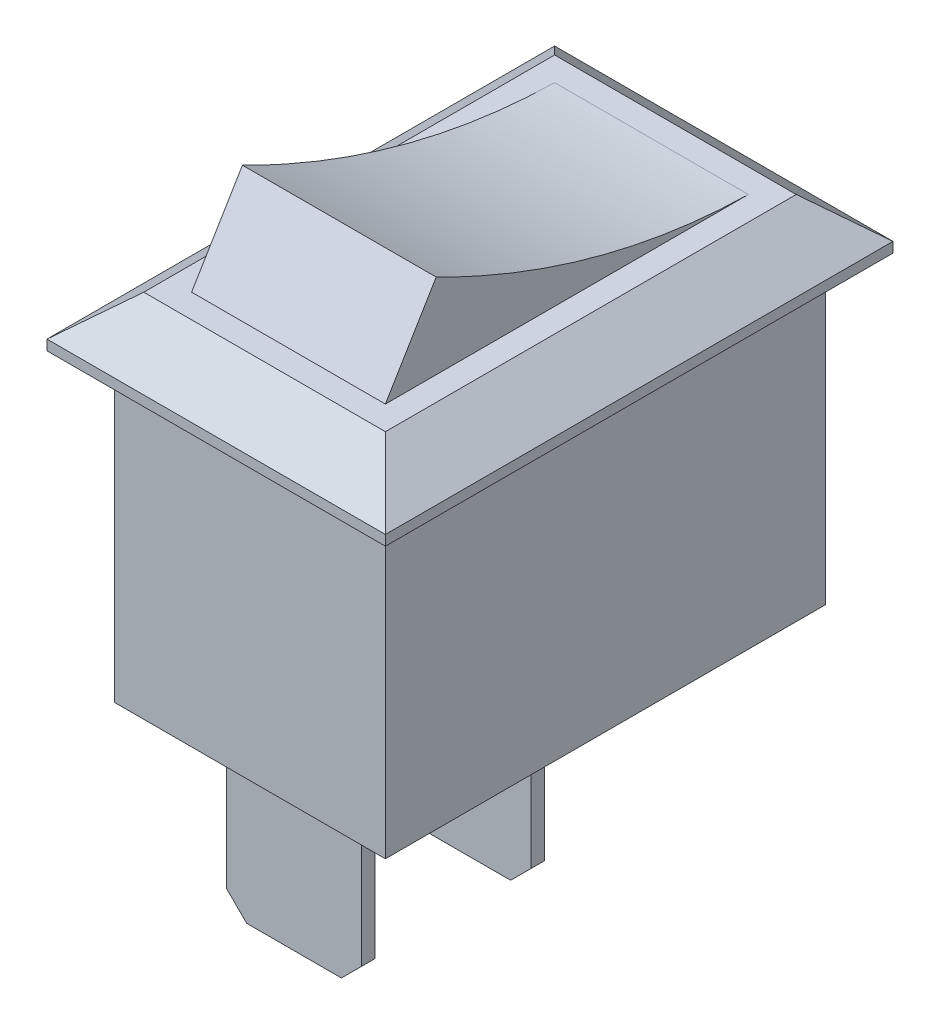
ISO-10303-21;
HEADER;
FILE_DESCRIPTION(('STEP AP214'),'2;1');
FILE_NAME('part.step','',(''),(''),'','','');
FILE_SCHEMA(('AUTOMOTIVE_DESIGN { 1 0 10303 214 1 1 1 1 }'));
ENDSEC;
DATA;
#1=APPLICATION_CONTEXT('core data for automotive mechanical design processes');
#2=APPLICATION_PROTOCOL_DEFINITION('international standard','automotive_design',2000,#1);
#3=PRODUCT_CONTEXT('',#1,'mechanical');
#4=PRODUCT('Part','Part','',(#3));
#5=PRODUCT_RELATED_PRODUCT_CATEGORY('part','',(#4));
#6=PRODUCT_DEFINITION_FORMATION('','',#4);
#7=PRODUCT_DEFINITION_CONTEXT('part definition',#1,'design');
#8=PRODUCT_DEFINITION('design','',#6,#7);
#9=PRODUCT_DEFINITION_SHAPE('','',#8);
#10=(LENGTH_UNIT() NAMED_UNIT(*) SI_UNIT(.MILLI.,.METRE.));
#11=(NAMED_UNIT(*) PLANE_ANGLE_UNIT() SI_UNIT($,.RADIAN.));
#12=(NAMED_UNIT(*) SI_UNIT($,.STERADIAN.) SOLID_ANGLE_UNIT());
#13=UNCERTAINTY_MEASURE_WITH_UNIT(LENGTH_MEASURE(1.E-05),#10,'distance_accuracy_value','');
#14=(GEOMETRIC_REPRESENTATION_CONTEXT(3) GLOBAL_UNCERTAINTY_ASSIGNED_CONTEXT((#13)) GLOBAL_UNIT_ASSIGNED_CONTEXT((#10,
#11,#12)) REPRESENTATION_CONTEXT('',''));
#15=CARTESIAN_POINT('',(0.,0.,0.));
#16=DIRECTION('',(0.,0.,1.));
#17=DIRECTION('',(1.,0.,0.));
#18=AXIS2_PLACEMENT_3D('',#15,#16,#17);
#19=CARTESIAN_POINT('',(0.,0.,0.));
#20=DIRECTION('',(0.,-1.,0.));
#21=DIRECTION('',(0.,0.,-1.));
#22=AXIS2_PLACEMENT_3D('',#19,#20,#21);
#23=PLANE('',#22);
#24=DIRECTION('',(-1.,0.,0.));
#25=VECTOR('',#24,1.);
#26=CARTESIAN_POINT('',(-1.99999999999999,0.,5.2));
#27=LINE('',#26,#25);
#28=CARTESIAN_POINT('',(2.00000000000001,0.,5.2));
#29=VERTEX_POINT('',#28);
#30=CARTESIAN_POINT('',(-1.99999999999999,0.,5.2));
#31=VERTEX_POINT('',#30);
#32=EDGE_CURVE('E243',#29,#31,#27,.T.);
#33=ORIENTED_EDGE('',*,*,#32,.F.);
#34=DIRECTION('',(0.,0.,1.));
#35=VECTOR('',#34,1.);
#36=CARTESIAN_POINT('',(2.00000000000001,0.,4.8));
#37=LINE('',#36,#35);
#38=CARTESIAN_POINT('',(2.00000000000001,0.,4.8));
#39=VERTEX_POINT('',#38);
#40=EDGE_CURVE('E208',#39,#29,#37,.T.);
#41=ORIENTED_EDGE('',*,*,#40,.F.);
#42=DIRECTION('',(1.,0.,0.));
#43=VECTOR('',#42,1.);
#44=CARTESIAN_POINT('',(-1.99999999999999,0.,4.8));
#45=LINE('',#44,#43);
#46=CARTESIAN_POINT('',(-1.99999999999999,0.,4.8));
#47=VERTEX_POINT('',#46);
#48=EDGE_CURVE('E237',#47,#39,#45,.T.);
#49=ORIENTED_EDGE('',*,*,#48,.F.);
#50=DIRECTION('',(0.,0.,-1.));
#51=VECTOR('',#50,1.);
#52=CARTESIAN_POINT('',(-1.99999999999999,0.,4.8));
#53=LINE('',#52,#51);
#54=EDGE_CURVE('E246',#31,#47,#53,.T.);
#55=ORIENTED_EDGE('',*,*,#54,.F.);
#56=EDGE_LOOP('',(#33,#41,#49,#55));
#57=FACE_BOUND('',#56,.T.);
#58=DIRECTION('',(0.,0.,1.));
#59=VECTOR('',#58,1.);
#60=CARTESIAN_POINT('',(-4.,0.,-6.5));
#61=LINE('',#60,#59);
#62=CARTESIAN_POINT('',(-4.,0.,-6.5));
#63=VERTEX_POINT('',#62);
#64=CARTESIAN_POINT('',(-4.,0.,6.5));
#65=VERTEX_POINT('',#64);
#66=EDGE_CURVE('E472',#63,#65,#61,.T.);
#67=ORIENTED_EDGE('',*,*,#66,.F.);
#68=DIRECTION('',(-1.,0.,0.));
#69=VECTOR('',#68,1.);
#70=CARTESIAN_POINT('',(4.,0.,-6.5));
#71=LINE('',#70,#69);
#72=CARTESIAN_POINT('',(4.,0.,-6.5));
#73=VERTEX_POINT('',#72);
#74=EDGE_CURVE('E465',#73,#63,#71,.T.);
#75=ORIENTED_EDGE('',*,*,#74,.F.);
#76=DIRECTION('',(0.,0.,-1.));
#77=VECTOR('',#76,1.);
#78=CARTESIAN_POINT('',(4.,0.,-6.5));
#79=LINE('',#78,#77);
#80=CARTESIAN_POINT('',(4.,0.,6.5));
#81=VERTEX_POINT('',#80);
#82=EDGE_CURVE('E468',#81,#73,#79,.T.);
#83=ORIENTED_EDGE('',*,*,#82,.F.);
#84=DIRECTION('',(1.,0.,0.));
#85=VECTOR('',#84,1.);
#86=CARTESIAN_POINT('',(4.,0.,6.5));
#87=LINE('',#86,#85);
#88=EDGE_CURVE('E470',#65,#81,#87,.T.);
#89=ORIENTED_EDGE('',*,*,#88,.F.);
#90=EDGE_LOOP('',(#67,#75,#83,#89));
#91=FACE_BOUND('',#90,.T.);
#92=DIRECTION('',(-1.,0.,0.));
#93=VECTOR('',#92,1.);
#94=CARTESIAN_POINT('',(-1.99999999999999,0.,0.2));
#95=LINE('',#94,#93);
#96=CARTESIAN_POINT('',(2.00000000000001,0.,0.2));
#97=VERTEX_POINT('',#96);
#98=CARTESIAN_POINT('',(-1.99999999999999,0.,0.2));
#99=VERTEX_POINT('',#98);
#100=EDGE_CURVE('E205',#97,#99,#95,.T.);
#101=ORIENTED_EDGE('',*,*,#100,.F.);
#102=DIRECTION('',(0.,0.,1.));
#103=VECTOR('',#102,1.);
#104=CARTESIAN_POINT('',(2.00000000000001,0.,-0.200000000000001));
#105=LINE('',#104,#103);
#106=CARTESIAN_POINT('',(2.00000000000001,0.,-0.200000000000001));
#107=VERTEX_POINT('',#106);
#108=EDGE_CURVE('E212',#107,#97,#105,.T.);
#109=ORIENTED_EDGE('',*,*,#108,.F.);
#110=DIRECTION('',(1.,0.,0.));
#111=VECTOR('',#110,1.);
#112=CARTESIAN_POINT('',(-1.99999999999999,0.,-0.200000000000001));
#113=LINE('',#112,#111);
#114=CARTESIAN_POINT('',(-1.99999999999999,0.,-0.200000000000001));
#115=VERTEX_POINT('',#114);
#116=EDGE_CURVE('E222',#115,#107,#113,.T.);
#117=ORIENTED_EDGE('',*,*,#116,.F.);
#118=DIRECTION('',(0.,0.,-1.));
#119=VECTOR('',#118,1.);
#120=CARTESIAN_POINT('',(-1.99999999999999,0.,-0.200000000000001));
#121=LINE('',#120,#119);
#122=EDGE_CURVE('E220',#99,#115,#121,.T.);
#123=ORIENTED_EDGE('',*,*,#122,.F.);
#124=EDGE_LOOP('',(#101,#109,#117,#123));
#125=FACE_BOUND('',#124,.T.);
#126=ADVANCED_FACE('F33',(#57,#91,#125),#23,.T.);
#127=CARTESIAN_POINT('',(0.,10.5,0.));
#128=DIRECTION('',(0.,-1.,0.));
#129=DIRECTION('',(0.,0.,-1.));
#130=AXIS2_PLACEMENT_3D('',#127,#128,#129);
#131=PLANE('',#130);
#132=DIRECTION('',(0.,0.,-1.));
#133=VECTOR('',#132,1.);
#134=CARTESIAN_POINT('',(3.56989568888695,10.5,0.));
#135=LINE('',#134,#133);
#136=CARTESIAN_POINT('',(3.56989568888695,10.5,6.06989568888695));
#137=VERTEX_POINT('',#136);
#138=CARTESIAN_POINT('',(3.56989568888695,10.5,-6.06989568888695));
#139=VERTEX_POINT('',#138);
#140=EDGE_CURVE('E450',#137,#139,#135,.T.);
#141=ORIENTED_EDGE('',*,*,#140,.T.);
#142=DIRECTION('',(-1.,0.,0.));
#143=VECTOR('',#142,1.);
#144=CARTESIAN_POINT('',(0.,10.5,-6.06989568888695));
#145=LINE('',#144,#143);
#146=CARTESIAN_POINT('',(-3.56989568888695,10.5,-6.06989568888695));
#147=VERTEX_POINT('',#146);
#148=EDGE_CURVE('E443',#139,#147,#145,.T.);
#149=ORIENTED_EDGE('',*,*,#148,.T.);
#150=DIRECTION('',(0.,0.,1.));
#151=VECTOR('',#150,1.);
#152=CARTESIAN_POINT('',(-3.56989568888695,10.5,0.));
#153=LINE('',#152,#151);
#154=CARTESIAN_POINT('',(-3.56989568888695,10.5,6.06989568888695));
#155=VERTEX_POINT('',#154);
#156=EDGE_CURVE('E446',#147,#155,#153,.T.);
#157=ORIENTED_EDGE('',*,*,#156,.T.);
#158=DIRECTION('',(1.,0.,0.));
#159=VECTOR('',#158,1.);
#160=CARTESIAN_POINT('',(0.,10.5,6.06989568888695));
#161=LINE('',#160,#159);
#162=EDGE_CURVE('E448',#155,#137,#161,.T.);
#163=ORIENTED_EDGE('',*,*,#162,.T.);
#164=EDGE_LOOP('',(#141,#149,#157,#163));
#165=FACE_BOUND('',#164,.T.);
#166=DIRECTION('',(0.,0.,1.));
#167=VECTOR('',#166,1.);
#168=CARTESIAN_POINT('',(-2.86278890770039,10.5,-5.36278890770041));
#169=LINE('',#168,#167);
#170=CARTESIAN_POINT('',(-2.86278890770039,10.5,-5.36278890770041));
#171=VERTEX_POINT('',#170);
#172=CARTESIAN_POINT('',(-2.86278890770039,10.5,5.36278890770041));
#173=VERTEX_POINT('',#172);
#174=EDGE_CURVE('E418',#171,#173,#169,.T.);
#175=ORIENTED_EDGE('',*,*,#174,.F.);
#176=DIRECTION('',(-1.,0.,0.));
#177=VECTOR('',#176,1.);
#178=CARTESIAN_POINT('',(-2.86278890770039,10.5,-5.36278890770041));
#179=LINE('',#178,#177);
#180=CARTESIAN_POINT('',(2.86278890770039,10.5,-5.36278890770041));
#181=VERTEX_POINT('',#180);
#182=EDGE_CURVE('E407',#181,#171,#179,.T.);
#183=ORIENTED_EDGE('',*,*,#182,.F.);
#184=DIRECTION('',(0.,0.,-1.));
#185=VECTOR('',#184,1.);
#186=CARTESIAN_POINT('',(2.86278890770039,10.5,-5.36278890770041));
#187=LINE('',#186,#185);
#188=CARTESIAN_POINT('',(2.86278890770039,10.5,5.36278890770041));
#189=VERTEX_POINT('',#188);
#190=EDGE_CURVE('E404',#189,#181,#187,.T.);
#191=ORIENTED_EDGE('',*,*,#190,.F.);
#192=DIRECTION('',(1.,0.,0.));
#193=VECTOR('',#192,1.);
#194=CARTESIAN_POINT('',(-2.86278890770039,10.5,5.36278890770041));
#195=LINE('',#194,#193);
#196=EDGE_CURVE('E408',#173,#189,#195,.T.);
#197=ORIENTED_EDGE('',*,*,#196,.F.);
#198=EDGE_LOOP('',(#175,#183,#191,#197));
#199=FACE_BOUND('',#198,.T.);
#200=ADVANCED_FACE('F290',(#165,#199),#131,.F.);
#201=CARTESIAN_POINT('',(-4.,9.,-6.5));
#202=DIRECTION('',(1.,0.,0.));
#203=DIRECTION('',(0.,0.,-1.));
#204=AXIS2_PLACEMENT_3D('',#201,#202,#203);
#205=PLANE('',#204);
#206=ORIENTED_EDGE('',*,*,#66,.T.);
#207=DIRECTION('',(0.,-1.,0.));
#208=VECTOR('',#207,1.);
#209=CARTESIAN_POINT('',(-4.,9.,6.5));
#210=LINE('',#209,#208);
#211=CARTESIAN_POINT('',(-4.,9.,6.5));
#212=VERTEX_POINT('',#211);
#213=EDGE_CURVE('E452',#212,#65,#210,.T.);
#214=ORIENTED_EDGE('',*,*,#213,.F.);
#215=DIRECTION('',(0.,0.,1.));
#216=VECTOR('',#215,1.);
#217=CARTESIAN_POINT('',(-4.,9.,-6.5));
#218=LINE('',#217,#216);
#219=CARTESIAN_POINT('',(-4.,9.,-6.5));
#220=VERTEX_POINT('',#219);
#221=EDGE_CURVE('E467',#220,#212,#218,.T.);
#222=ORIENTED_EDGE('',*,*,#221,.F.);
#223=DIRECTION('',(0.,-1.,0.));
#224=VECTOR('',#223,1.);
#225=CARTESIAN_POINT('',(-4.,9.,-6.5));
#226=LINE('',#225,#224);
#227=EDGE_CURVE('E461',#220,#63,#226,.T.);
#228=ORIENTED_EDGE('',*,*,#227,.T.);
#229=EDGE_LOOP('',(#206,#214,#222,#228));
#230=FACE_BOUND('',#229,.T.);
#231=ADVANCED_FACE('F293',(#230),#205,.F.);
#232=CARTESIAN_POINT('',(4.,9.,6.5));
#233=DIRECTION('',(0.,0.,-1.));
#234=DIRECTION('',(-1.,0.,0.));
#235=AXIS2_PLACEMENT_3D('',#232,#233,#234);
#236=PLANE('',#235);
#237=ORIENTED_EDGE('',*,*,#88,.T.);
#238=DIRECTION('',(0.,-1.,0.));
#239=VECTOR('',#238,1.);
#240=CARTESIAN_POINT('',(4.,9.,6.5));
#241=LINE('',#240,#239);
#242=CARTESIAN_POINT('',(4.,9.,6.5));
#243=VERTEX_POINT('',#242);
#244=EDGE_CURVE('E455',#243,#81,#241,.T.);
#245=ORIENTED_EDGE('',*,*,#244,.F.);
#246=DIRECTION('',(1.,0.,0.));
#247=VECTOR('',#246,1.);
#248=CARTESIAN_POINT('',(4.,9.,6.5));
#249=LINE('',#248,#247);
#250=EDGE_CURVE('E481',#212,#243,#249,.T.);
#251=ORIENTED_EDGE('',*,*,#250,.F.);
#252=ORIENTED_EDGE('',*,*,#213,.T.);
#253=EDGE_LOOP('',(#237,#245,#251,#252));
#254=FACE_BOUND('',#253,.T.);
#255=ADVANCED_FACE('F326',(#254),#236,.F.);
#256=CARTESIAN_POINT('',(4.,9.,-6.5));
#257=DIRECTION('',(-1.,0.,0.));
#258=DIRECTION('',(0.,0.,1.));
#259=AXIS2_PLACEMENT_3D('',#256,#257,#258);
#260=PLANE('',#259);
#261=ORIENTED_EDGE('',*,*,#82,.T.);
#262=DIRECTION('',(0.,-1.,0.));
#263=VECTOR('',#262,1.);
#264=CARTESIAN_POINT('',(4.,9.,-6.5));
#265=LINE('',#264,#263);
#266=CARTESIAN_POINT('',(4.,9.,-6.5));
#267=VERTEX_POINT('',#266);
#268=EDGE_CURVE('E458',#267,#73,#265,.T.);
#269=ORIENTED_EDGE('',*,*,#268,.F.);
#270=DIRECTION('',(0.,0.,-1.));
#271=VECTOR('',#270,1.);
#272=CARTESIAN_POINT('',(4.,9.,-6.5));
#273=LINE('',#272,#271);
#274=EDGE_CURVE('E478',#243,#267,#273,.T.);
#275=ORIENTED_EDGE('',*,*,#274,.F.);
#276=ORIENTED_EDGE('',*,*,#244,.T.);
#277=EDGE_LOOP('',(#261,#269,#275,#276));
#278=FACE_BOUND('',#277,.T.);
#279=ADVANCED_FACE('F322',(#278),#260,.F.);
#280=CARTESIAN_POINT('',(4.,9.,-6.5));
#281=DIRECTION('',(0.,0.,1.));
#282=DIRECTION('',(1.,0.,0.));
#283=AXIS2_PLACEMENT_3D('',#280,#281,#282);
#284=PLANE('',#283);
#285=ORIENTED_EDGE('',*,*,#74,.T.);
#286=ORIENTED_EDGE('',*,*,#227,.F.);
#287=DIRECTION('',(-1.,0.,0.));
#288=VECTOR('',#287,1.);
#289=CARTESIAN_POINT('',(4.,9.,-6.5));
#290=LINE('',#289,#288);
#291=EDGE_CURVE('E464',#267,#220,#290,.T.);
#292=ORIENTED_EDGE('',*,*,#291,.F.);
#293=ORIENTED_EDGE('',*,*,#268,.T.);
#294=EDGE_LOOP('',(#285,#286,#292,#293));
#295=FACE_BOUND('',#294,.T.);
#296=ADVANCED_FACE('F299',(#295),#284,.F.);
#297=CARTESIAN_POINT('',(0.,9.,0.));
#298=DIRECTION('',(0.,-1.,0.));
#299=DIRECTION('',(0.,0.,-1.));
#300=AXIS2_PLACEMENT_3D('',#297,#298,#299);
#301=PLANE('',#300);
#302=DIRECTION('',(0.,0.,-1.));
#303=VECTOR('',#302,1.);
#304=CARTESIAN_POINT('',(5.,9.,7.5));
#305=LINE('',#304,#303);
#306=CARTESIAN_POINT('',(5.,9.,7.5));
#307=VERTEX_POINT('',#306);
#308=CARTESIAN_POINT('',(5.,9.,-7.5));
#309=VERTEX_POINT('',#308);
#310=EDGE_CURVE('E428',#307,#309,#305,.T.);
#311=ORIENTED_EDGE('',*,*,#310,.F.);
#312=DIRECTION('',(1.,0.,0.));
#313=VECTOR('',#312,1.);
#314=CARTESIAN_POINT('',(-5.,9.,7.5));
#315=LINE('',#314,#313);
#316=CARTESIAN_POINT('',(-5.,9.,7.5));
#317=VERTEX_POINT('',#316);
#318=EDGE_CURVE('E493',#317,#307,#315,.T.);
#319=ORIENTED_EDGE('',*,*,#318,.F.);
#320=DIRECTION('',(0.,0.,1.));
#321=VECTOR('',#320,1.);
#322=CARTESIAN_POINT('',(-5.,9.,7.5));
#323=LINE('',#322,#321);
#324=CARTESIAN_POINT('',(-5.,9.,-7.5));
#325=VERTEX_POINT('',#324);
#326=EDGE_CURVE('E496',#325,#317,#323,.T.);
#327=ORIENTED_EDGE('',*,*,#326,.F.);
#328=DIRECTION('',(-1.,0.,0.));
#329=VECTOR('',#328,1.);
#330=CARTESIAN_POINT('',(-5.,9.,-7.5));
#331=LINE('',#330,#329);
#332=EDGE_CURVE('E499',#309,#325,#331,.T.);
#333=ORIENTED_EDGE('',*,*,#332,.F.);
#334=EDGE_LOOP('',(#311,#319,#327,#333));
#335=FACE_BOUND('',#334,.T.);
#336=ORIENTED_EDGE('',*,*,#221,.T.);
#337=ORIENTED_EDGE('',*,*,#250,.T.);
#338=ORIENTED_EDGE('',*,*,#274,.T.);
#339=ORIENTED_EDGE('',*,*,#291,.T.);
#340=EDGE_LOOP('',(#336,#337,#338,#339));
#341=FACE_BOUND('',#340,.T.);
#342=ADVANCED_FACE('F295',(#335,#341),#301,.T.);
#343=CARTESIAN_POINT('',(5.,10.5,7.5));
#344=DIRECTION('',(-1.,0.,0.));
#345=DIRECTION('',(0.,0.,1.));
#346=AXIS2_PLACEMENT_3D('',#343,#344,#345);
#347=PLANE('',#346);
#348=DIRECTION('',(0.,-1.,0.));
#349=VECTOR('',#348,1.);
#350=CARTESIAN_POINT('',(5.,10.5,-7.5));
#351=LINE('',#350,#349);
#352=CARTESIAN_POINT('',(5.,9.3,-7.5));
#353=VERTEX_POINT('',#352);
#354=EDGE_CURVE('E475',#353,#309,#351,.T.);
#355=ORIENTED_EDGE('',*,*,#354,.F.);
#356=DIRECTION('',(0.,0.,1.));
#357=VECTOR('',#356,1.);
#358=CARTESIAN_POINT('',(5.,9.3,7.5));
#359=LINE('',#358,#357);
#360=CARTESIAN_POINT('',(5.,9.3,7.5));
#361=VERTEX_POINT('',#360);
#362=EDGE_CURVE('E424',#353,#361,#359,.T.);
#363=ORIENTED_EDGE('',*,*,#362,.T.);
#364=DIRECTION('',(0.,-1.,0.));
#365=VECTOR('',#364,1.);
#366=CARTESIAN_POINT('',(5.,10.5,7.5));
#367=LINE('',#366,#365);
#368=EDGE_CURVE('E491',#361,#307,#367,.T.);
#369=ORIENTED_EDGE('',*,*,#368,.T.);
#370=ORIENTED_EDGE('',*,*,#310,.T.);
#371=EDGE_LOOP('',(#355,#363,#369,#370));
#372=FACE_BOUND('',#371,.T.);
#373=ADVANCED_FACE('F298',(#372),#347,.F.);
#374=CARTESIAN_POINT('',(-5.,10.5,-7.5));
#375=DIRECTION('',(0.,0.,1.));
#376=DIRECTION('',(1.,0.,0.));
#377=AXIS2_PLACEMENT_3D('',#374,#375,#376);
#378=PLANE('',#377);
#379=DIRECTION('',(0.,-1.,0.));
#380=VECTOR('',#379,1.);
#381=CARTESIAN_POINT('',(-5.,10.5,-7.5));
#382=LINE('',#381,#380);
#383=CARTESIAN_POINT('',(-5.,9.3,-7.5));
#384=VERTEX_POINT('',#383);
#385=EDGE_CURVE('E487',#384,#325,#382,.T.);
#386=ORIENTED_EDGE('',*,*,#385,.F.);
#387=DIRECTION('',(1.,0.,0.));
#388=VECTOR('',#387,1.);
#389=CARTESIAN_POINT('',(-5.,9.3,-7.5));
#390=LINE('',#389,#388);
#391=EDGE_CURVE('E440',#384,#353,#390,.T.);
#392=ORIENTED_EDGE('',*,*,#391,.T.);
#393=ORIENTED_EDGE('',*,*,#354,.T.);
#394=ORIENTED_EDGE('',*,*,#332,.T.);
#395=EDGE_LOOP('',(#386,#392,#393,#394));
#396=FACE_BOUND('',#395,.T.);
#397=ADVANCED_FACE('F309',(#396),#378,.F.);
#398=CARTESIAN_POINT('',(-5.,10.5,7.5));
#399=DIRECTION('',(1.,0.,0.));
#400=DIRECTION('',(0.,0.,-1.));
#401=AXIS2_PLACEMENT_3D('',#398,#399,#400);
#402=PLANE('',#401);
#403=DIRECTION('',(0.,-1.,0.));
#404=VECTOR('',#403,1.);
#405=CARTESIAN_POINT('',(-5.,10.5,7.5));
#406=LINE('',#405,#404);
#407=CARTESIAN_POINT('',(-5.,9.3,7.5));
#408=VERTEX_POINT('',#407);
#409=EDGE_CURVE('E489',#408,#317,#406,.T.);
#410=ORIENTED_EDGE('',*,*,#409,.F.);
#411=DIRECTION('',(0.,0.,-1.));
#412=VECTOR('',#411,1.);
#413=CARTESIAN_POINT('',(-5.,9.3,7.5));
#414=LINE('',#413,#412);
#415=EDGE_CURVE('E438',#408,#384,#414,.T.);
#416=ORIENTED_EDGE('',*,*,#415,.T.);
#417=ORIENTED_EDGE('',*,*,#385,.T.);
#418=ORIENTED_EDGE('',*,*,#326,.T.);
#419=EDGE_LOOP('',(#410,#416,#417,#418));
#420=FACE_BOUND('',#419,.T.);
#421=ADVANCED_FACE('F305',(#420),#402,.F.);
#422=CARTESIAN_POINT('',(-5.,10.5,7.5));
#423=DIRECTION('',(0.,0.,-1.));
#424=DIRECTION('',(-1.,0.,0.));
#425=AXIS2_PLACEMENT_3D('',#422,#423,#424);
#426=PLANE('',#425);
#427=ORIENTED_EDGE('',*,*,#368,.F.);
#428=DIRECTION('',(-1.,0.,0.));
#429=VECTOR('',#428,1.);
#430=CARTESIAN_POINT('',(-5.,9.3,7.5));
#431=LINE('',#430,#429);
#432=EDGE_CURVE('E436',#361,#408,#431,.T.);
#433=ORIENTED_EDGE('',*,*,#432,.T.);
#434=ORIENTED_EDGE('',*,*,#409,.T.);
#435=ORIENTED_EDGE('',*,*,#318,.T.);
#436=EDGE_LOOP('',(#427,#433,#434,#435));
#437=FACE_BOUND('',#436,.T.);
#438=ADVANCED_FACE('F301',(#437),#426,.F.);
#439=CARTESIAN_POINT('',(0.,10.5,6.06989568888695));
#440=DIRECTION('',(0.,-0.766044443118977,-0.64278760968654));
#441=DIRECTION('',(1.,0.,0.));
#442=AXIS2_PLACEMENT_3D('',#439,#440,#441);
#443=PLANE('',#442);
#444=DIRECTION('',(-0.608120402411343,-0.510273605374738,0.608120402411342));
#445=VECTOR('',#444,1.);
#446=CARTESIAN_POINT('',(-2.24971105115459,11.6077664426071,4.74971105115459));
#447=LINE('',#446,#445);
#448=EDGE_CURVE('E429',#408,#155,#447,.F.);
#449=ORIENTED_EDGE('',*,*,#448,.F.);
#450=ORIENTED_EDGE('',*,*,#432,.F.);
#451=DIRECTION('',(0.608120402411342,-0.510273605374738,0.608120402411342));
#452=VECTOR('',#451,1.);
#453=CARTESIAN_POINT('',(1.32518499158225,12.3835359182081,3.82518499158225));
#454=LINE('',#453,#452);
#455=EDGE_CURVE('E425',#137,#361,#454,.T.);
#456=ORIENTED_EDGE('',*,*,#455,.F.);
#457=ORIENTED_EDGE('',*,*,#162,.F.);
#458=EDGE_LOOP('',(#449,#450,#456,#457));
#459=FACE_BOUND('',#458,.T.);
#460=ADVANCED_FACE('F304',(#459),#443,.F.);
#461=CARTESIAN_POINT('',(3.56989568888695,10.5,0.));
#462=DIRECTION('',(-0.64278760968654,-0.766044443118977,0.));
#463=DIRECTION('',(0.,0.,-1.));
#464=AXIS2_PLACEMENT_3D('',#461,#462,#463);
#465=PLANE('',#464);
#466=ORIENTED_EDGE('',*,*,#455,.T.);
#467=ORIENTED_EDGE('',*,*,#362,.F.);
#468=DIRECTION('',(-0.608120402411342,0.510273605374738,0.608120402411342));
#469=VECTOR('',#468,1.);
#470=CARTESIAN_POINT('',(1.32518499158225,12.3835359182081,-3.82518499158225));
#471=LINE('',#470,#469);
#472=EDGE_CURVE('E432',#139,#353,#471,.F.);
#473=ORIENTED_EDGE('',*,*,#472,.F.);
#474=ORIENTED_EDGE('',*,*,#140,.F.);
#475=EDGE_LOOP('',(#466,#467,#473,#474));
#476=FACE_BOUND('',#475,.T.);
#477=ADVANCED_FACE('F340',(#476),#465,.F.);
#478=CARTESIAN_POINT('',(-3.56989568888695,10.5,0.));
#479=DIRECTION('',(0.64278760968654,-0.766044443118977,0.));
#480=DIRECTION('',(0.,0.,1.));
#481=AXIS2_PLACEMENT_3D('',#478,#479,#480);
#482=PLANE('',#481);
#483=ORIENTED_EDGE('',*,*,#448,.T.);
#484=ORIENTED_EDGE('',*,*,#156,.F.);
#485=DIRECTION('',(-0.608120402411342,-0.510273605374738,-0.608120402411342));
#486=VECTOR('',#485,1.);
#487=CARTESIAN_POINT('',(-1.32518499158225,12.3835359182081,-3.82518499158225));
#488=LINE('',#487,#486);
#489=EDGE_CURVE('E412',#384,#147,#488,.F.);
#490=ORIENTED_EDGE('',*,*,#489,.F.);
#491=ORIENTED_EDGE('',*,*,#415,.F.);
#492=EDGE_LOOP('',(#483,#484,#490,#491));
#493=FACE_BOUND('',#492,.T.);
#494=ADVANCED_FACE('F336',(#493),#482,.F.);
#495=CARTESIAN_POINT('',(0.,10.5,-6.06989568888695));
#496=DIRECTION('',(0.,-0.766044443118977,0.64278760968654));
#497=DIRECTION('',(-1.,0.,0.));
#498=AXIS2_PLACEMENT_3D('',#495,#496,#497);
#499=PLANE('',#498);
#500=ORIENTED_EDGE('',*,*,#472,.T.);
#501=ORIENTED_EDGE('',*,*,#391,.F.);
#502=ORIENTED_EDGE('',*,*,#489,.T.);
#503=ORIENTED_EDGE('',*,*,#148,.F.);
#504=EDGE_LOOP('',(#500,#501,#502,#503));
#505=FACE_BOUND('',#504,.T.);
#506=ADVANCED_FACE('F288',(#505),#499,.F.);
#507=CARTESIAN_POINT('',(-2.86278890770039,13.,-5.36278890770041));
#508=DIRECTION('',(1.,0.,0.));
#509=DIRECTION('',(0.,0.,-1.));
#510=AXIS2_PLACEMENT_3D('',#507,#508,#509);
#511=PLANE('',#510);
#512=DIRECTION('',(0.,-0.857492925712544,0.514495755427527));
#513=VECTOR('',#512,1.);
#514=CARTESIAN_POINT('',(-2.86278890770039,13.,3.86278890770041));
#515=LINE('',#514,#513);
#516=CARTESIAN_POINT('',(-2.86278890770039,13.,3.86278890770041));
#517=VERTEX_POINT('',#516);
#518=EDGE_CURVE('E419',#517,#173,#515,.T.);
#519=ORIENTED_EDGE('',*,*,#518,.F.);
#520=CARTESIAN_POINT('',(-2.86278890770039,10.5,-5.36278890770041));
#521=CARTESIAN_POINT('',(-2.86278890770039,10.5856492015875,-0.886352769139244));
#522=CARTESIAN_POINT('',(-2.86278890770039,13.,3.86278890770041));
#523=B_SPLINE_CURVE_WITH_KNOTS('',2,(#520,#521,#522),.UNSPECIFIED.,.F.,.F.,(3,3),(0.,
0.869788285007968),.UNSPECIFIED.);
#524=EDGE_CURVE('E258',#171,#517,#523,.T.);
#525=ORIENTED_EDGE('',*,*,#524,.F.);
#526=ORIENTED_EDGE('',*,*,#174,.T.);
#527=EDGE_LOOP('',(#519,#525,#526));
#528=FACE_BOUND('',#527,.T.);
#529=ADVANCED_FACE('F284',(#528),#511,.F.);
#530=CARTESIAN_POINT('',(2.86278890770039,13.,-5.36278890770041));
#531=DIRECTION('',(-1.,0.,0.));
#532=DIRECTION('',(0.,0.,1.));
#533=AXIS2_PLACEMENT_3D('',#530,#531,#532);
#534=PLANE('',#533);
#535=ORIENTED_EDGE('',*,*,#190,.T.);
#536=CARTESIAN_POINT('',(2.86278890770039,10.5,-5.36278890770041));
#537=CARTESIAN_POINT('',(2.86278890770039,10.5856492015875,-0.886352769139244));
#538=CARTESIAN_POINT('',(2.86278890770039,13.,3.86278890770041));
#539=B_SPLINE_CURVE_WITH_KNOTS('',2,(#536,#537,#538),.UNSPECIFIED.,.F.,.F.,(3,3),(0.,
0.869788285007968),.UNSPECIFIED.);
#540=CARTESIAN_POINT('',(2.86278890770039,13.,3.86278890770041));
#541=VERTEX_POINT('',#540);
#542=EDGE_CURVE('E508',#181,#541,#539,.T.);
#543=ORIENTED_EDGE('',*,*,#542,.T.);
#544=DIRECTION('',(0.,-0.857492925712544,0.514495755427527));
#545=VECTOR('',#544,1.);
#546=CARTESIAN_POINT('',(2.86278890770039,17.0701078597357,1.42072419185901));
#547=LINE('',#546,#545);
#548=EDGE_CURVE('E415',#541,#189,#547,.T.);
#549=ORIENTED_EDGE('',*,*,#548,.T.);
#550=EDGE_LOOP('',(#535,#543,#549));
#551=FACE_BOUND('',#550,.T.);
#552=ADVANCED_FACE('F280',(#551),#534,.F.);
#553=CARTESIAN_POINT('',(7.13721109229961,13.,3.86278890770041));
#554=DIRECTION('',(0.,-0.514495755427527,-0.857492925712544));
#555=DIRECTION('',(0.,0.857492925712544,-0.514495755427527));
#556=AXIS2_PLACEMENT_3D('',#553,#554,#555);
#557=PLANE('',#556);
#558=DIRECTION('',(-1.,0.,0.));
#559=VECTOR('',#558,1.);
#560=CARTESIAN_POINT('',(0.,13.,3.86278890770041));
#561=LINE('',#560,#559);
#562=EDGE_CURVE('E401',#541,#517,#561,.T.);
#563=ORIENTED_EDGE('',*,*,#562,.T.);
#564=ORIENTED_EDGE('',*,*,#518,.T.);
#565=ORIENTED_EDGE('',*,*,#196,.T.);
#566=ORIENTED_EDGE('',*,*,#548,.F.);
#567=EDGE_LOOP('',(#563,#564,#565,#566));
#568=FACE_BOUND('',#567,.T.);
#569=ADVANCED_FACE('F275',(#568),#557,.F.);
#570=CARTESIAN_POINT('',(7.13721109229961,10.5,-5.36278890770041));
#571=CARTESIAN_POINT('',(7.13721109229961,10.5856492015875,-0.886352769139244));
#572=CARTESIAN_POINT('',(7.13721109229961,13.,3.86278890770041));
#573=B_SPLINE_CURVE_WITH_KNOTS('',2,(#570,#571,#572),.UNSPECIFIED.,.F.,.F.,(3,3),(0.,
0.869788285007968),.UNSPECIFIED.);
#574=DIRECTION('',(-1.,0.,0.));
#575=VECTOR('',#574,1.);
#576=SURFACE_OF_LINEAR_EXTRUSION('',#573,#575);
#577=ORIENTED_EDGE('',*,*,#182,.T.);
#578=ORIENTED_EDGE('',*,*,#524,.T.);
#579=ORIENTED_EDGE('',*,*,#562,.F.);
#580=ORIENTED_EDGE('',*,*,#542,.F.);
#581=EDGE_LOOP('',(#577,#578,#579,#580));
#582=FACE_BOUND('',#581,.T.);
#583=ADVANCED_FACE('F270',(#582),#576,.F.);
#584=CARTESIAN_POINT('',(2.00000000000001,-5.,4.8));
#585=DIRECTION('',(-1.,0.,0.));
#586=DIRECTION('',(0.,0.,1.));
#587=AXIS2_PLACEMENT_3D('',#584,#585,#586);
#588=PLANE('',#587);
#589=DIRECTION('',(0.,1.,0.));
#590=VECTOR('',#589,1.);
#591=CARTESIAN_POINT('',(2.00000000000001,-5.,5.2));
#592=LINE('',#591,#590);
#593=CARTESIAN_POINT('',(2.00000000000001,-4.39999999999999,5.2));
#594=VERTEX_POINT('',#593);
#595=EDGE_CURVE('E256',#594,#29,#592,.T.);
#596=ORIENTED_EDGE('',*,*,#595,.F.);
#597=DIRECTION('',(0.,0.,-1.));
#598=VECTOR('',#597,1.);
#599=CARTESIAN_POINT('',(2.00000000000001,-4.39999999999999,4.8));
#600=LINE('',#599,#598);
#601=CARTESIAN_POINT('',(2.00000000000001,-4.39999999999999,4.8));
#602=VERTEX_POINT('',#601);
#603=EDGE_CURVE('E389',#594,#602,#600,.T.);
#604=ORIENTED_EDGE('',*,*,#603,.T.);
#605=DIRECTION('',(0.,1.,0.));
#606=VECTOR('',#605,1.);
#607=CARTESIAN_POINT('',(2.00000000000001,-5.,4.8));
#608=LINE('',#607,#606);
#609=EDGE_CURVE('E240',#602,#39,#608,.T.);
#610=ORIENTED_EDGE('',*,*,#609,.T.);
#611=ORIENTED_EDGE('',*,*,#40,.T.);
#612=EDGE_LOOP('',(#596,#604,#610,#611));
#613=FACE_BOUND('',#612,.T.);
#614=ADVANCED_FACE('F274',(#613),#588,.F.);
#615=CARTESIAN_POINT('',(-1.99999999999999,-5.,5.2));
#616=DIRECTION('',(0.,0.,-1.));
#617=DIRECTION('',(-1.,0.,0.));
#618=AXIS2_PLACEMENT_3D('',#615,#616,#617);
#619=PLANE('',#618);
#620=DIRECTION('',(-1.,0.,0.));
#621=VECTOR('',#620,1.);
#622=CARTESIAN_POINT('',(-1.99999999999999,-5.,5.2));
#623=LINE('',#622,#621);
#624=CARTESIAN_POINT('',(1.40000000000001,-5.,5.2));
#625=VERTEX_POINT('',#624);
#626=CARTESIAN_POINT('',(-1.4,-5.,5.2));
#627=VERTEX_POINT('',#626);
#628=EDGE_CURVE('E233',#625,#627,#623,.T.);
#629=ORIENTED_EDGE('',*,*,#628,.F.);
#630=DIRECTION('',(-0.707106781186544,-0.707106781186552,0.));
#631=VECTOR('',#630,1.);
#632=CARTESIAN_POINT('',(1.40000000000001,-5.,5.2));
#633=LINE('',#632,#631);
#634=EDGE_CURVE('E391',#625,#594,#633,.F.);
#635=ORIENTED_EDGE('',*,*,#634,.T.);
#636=ORIENTED_EDGE('',*,*,#595,.T.);
#637=ORIENTED_EDGE('',*,*,#32,.T.);
#638=DIRECTION('',(0.,1.,0.));
#639=VECTOR('',#638,1.);
#640=CARTESIAN_POINT('',(-1.99999999999999,-5.,5.2));
#641=LINE('',#640,#639);
#642=CARTESIAN_POINT('',(-1.99999999999999,-4.4,5.2));
#643=VERTEX_POINT('',#642);
#644=EDGE_CURVE('E254',#643,#31,#641,.T.);
#645=ORIENTED_EDGE('',*,*,#644,.F.);
#646=DIRECTION('',(-0.707106781186545,0.70710678118655,0.));
#647=VECTOR('',#646,1.);
#648=CARTESIAN_POINT('',(-1.4,-5.,5.2));
#649=LINE('',#648,#647);
#650=EDGE_CURVE('E393',#643,#627,#649,.F.);
#651=ORIENTED_EDGE('',*,*,#650,.T.);
#652=EDGE_LOOP('',(#629,#635,#636,#637,#645,#651));
#653=FACE_BOUND('',#652,.T.);
#654=ADVANCED_FACE('F566',(#653),#619,.F.);
#655=CARTESIAN_POINT('',(-1.99999999999999,-5.,4.8));
#656=DIRECTION('',(1.,0.,0.));
#657=DIRECTION('',(0.,0.,-1.));
#658=AXIS2_PLACEMENT_3D('',#655,#656,#657);
#659=PLANE('',#658);
#660=DIRECTION('',(0.,1.,0.));
#661=VECTOR('',#660,1.);
#662=CARTESIAN_POINT('',(-1.99999999999999,-5.,4.8));
#663=LINE('',#662,#661);
#664=CARTESIAN_POINT('',(-1.99999999999999,-4.4,4.8));
#665=VERTEX_POINT('',#664);
#666=EDGE_CURVE('E252',#665,#47,#663,.T.);
#667=ORIENTED_EDGE('',*,*,#666,.F.);
#668=DIRECTION('',(0.,0.,1.));
#669=VECTOR('',#668,1.);
#670=CARTESIAN_POINT('',(-1.99999999999999,-4.4,4.8));
#671=LINE('',#670,#669);
#672=EDGE_CURVE('E383',#665,#643,#671,.T.);
#673=ORIENTED_EDGE('',*,*,#672,.T.);
#674=ORIENTED_EDGE('',*,*,#644,.T.);
#675=ORIENTED_EDGE('',*,*,#54,.T.);
#676=EDGE_LOOP('',(#667,#673,#674,#675));
#677=FACE_BOUND('',#676,.T.);
#678=ADVANCED_FACE('F571',(#677),#659,.F.);
#679=CARTESIAN_POINT('',(-1.99999999999999,-5.,4.8));
#680=DIRECTION('',(0.,0.,1.));
#681=DIRECTION('',(1.,0.,0.));
#682=AXIS2_PLACEMENT_3D('',#679,#680,#681);
#683=PLANE('',#682);
#684=ORIENTED_EDGE('',*,*,#609,.F.);
#685=DIRECTION('',(0.707106781186544,0.707106781186552,0.));
#686=VECTOR('',#685,1.);
#687=CARTESIAN_POINT('',(1.40000000000001,-5.,4.8));
#688=LINE('',#687,#686);
#689=CARTESIAN_POINT('',(1.40000000000001,-5.,4.8));
#690=VERTEX_POINT('',#689);
#691=EDGE_CURVE('E385',#602,#690,#688,.F.);
#692=ORIENTED_EDGE('',*,*,#691,.T.);
#693=DIRECTION('',(1.,0.,0.));
#694=VECTOR('',#693,1.);
#695=CARTESIAN_POINT('',(-1.99999999999999,-5.,4.8));
#696=LINE('',#695,#694);
#697=CARTESIAN_POINT('',(-1.4,-5.,4.8));
#698=VERTEX_POINT('',#697);
#699=EDGE_CURVE('E236',#698,#690,#696,.T.);
#700=ORIENTED_EDGE('',*,*,#699,.F.);
#701=DIRECTION('',(0.707106781186545,-0.70710678118655,0.));
#702=VECTOR('',#701,1.);
#703=CARTESIAN_POINT('',(-1.4,-5.,4.8));
#704=LINE('',#703,#702);
#705=EDGE_CURVE('E387',#698,#665,#704,.F.);
#706=ORIENTED_EDGE('',*,*,#705,.T.);
#707=ORIENTED_EDGE('',*,*,#666,.T.);
#708=ORIENTED_EDGE('',*,*,#48,.T.);
#709=EDGE_LOOP('',(#684,#692,#700,#706,#707,#708));
#710=FACE_BOUND('',#709,.T.);
#711=ADVANCED_FACE('F561',(#710),#683,.F.);
#712=CARTESIAN_POINT('',(0.,-5.,0.));
#713=DIRECTION('',(0.,1.,0.));
#714=DIRECTION('',(0.,0.,1.));
#715=AXIS2_PLACEMENT_3D('',#712,#713,#714);
#716=PLANE('',#715);
#717=ORIENTED_EDGE('',*,*,#699,.T.);
#718=DIRECTION('',(0.,0.,1.));
#719=VECTOR('',#718,1.);
#720=CARTESIAN_POINT('',(1.40000000000001,-5.,0.));
#721=LINE('',#720,#719);
#722=EDGE_CURVE('E395',#690,#625,#721,.T.);
#723=ORIENTED_EDGE('',*,*,#722,.T.);
#724=ORIENTED_EDGE('',*,*,#628,.T.);
#725=DIRECTION('',(0.,0.,-1.));
#726=VECTOR('',#725,1.);
#727=CARTESIAN_POINT('',(-1.4,-5.,0.));
#728=LINE('',#727,#726);
#729=EDGE_CURVE('E398',#627,#698,#728,.T.);
#730=ORIENTED_EDGE('',*,*,#729,.T.);
#731=EDGE_LOOP('',(#717,#723,#724,#730));
#732=FACE_BOUND('',#731,.T.);
#733=ADVANCED_FACE('F352',(#732),#716,.F.);
#734=CARTESIAN_POINT('',(1.40000000000001,-5.,0.));
#735=DIRECTION('',(-0.707106781186552,0.707106781186544,0.));
#736=DIRECTION('',(0.,0.,1.));
#737=AXIS2_PLACEMENT_3D('',#734,#735,#736);
#738=PLANE('',#737);
#739=ORIENTED_EDGE('',*,*,#691,.F.);
#740=ORIENTED_EDGE('',*,*,#603,.F.);
#741=ORIENTED_EDGE('',*,*,#634,.F.);
#742=ORIENTED_EDGE('',*,*,#722,.F.);
#743=EDGE_LOOP('',(#739,#740,#741,#742));
#744=FACE_BOUND('',#743,.T.);
#745=ADVANCED_FACE('F348',(#744),#738,.F.);
#746=CARTESIAN_POINT('',(-1.4,-5.,0.));
#747=DIRECTION('',(0.70710678118655,0.707106781186545,0.));
#748=DIRECTION('',(0.,0.,-1.));
#749=AXIS2_PLACEMENT_3D('',#746,#747,#748);
#750=PLANE('',#749);
#751=ORIENTED_EDGE('',*,*,#650,.F.);
#752=ORIENTED_EDGE('',*,*,#672,.F.);
#753=ORIENTED_EDGE('',*,*,#705,.F.);
#754=ORIENTED_EDGE('',*,*,#729,.F.);
#755=EDGE_LOOP('',(#751,#752,#753,#754));
#756=FACE_BOUND('',#755,.T.);
#757=ADVANCED_FACE('F351',(#756),#750,.F.);
#758=CARTESIAN_POINT('',(2.00000000000001,-5.,-0.200000000000001));
#759=DIRECTION('',(-1.,0.,0.));
#760=DIRECTION('',(0.,0.,1.));
#761=AXIS2_PLACEMENT_3D('',#758,#759,#760);
#762=PLANE('',#761);
#763=DIRECTION('',(0.,1.,0.));
#764=VECTOR('',#763,1.);
#765=CARTESIAN_POINT('',(2.00000000000001,-5.,0.2));
#766=LINE('',#765,#764);
#767=CARTESIAN_POINT('',(2.00000000000001,-4.4,0.2));
#768=VERTEX_POINT('',#767);
#769=EDGE_CURVE('E199',#768,#97,#766,.T.);
#770=ORIENTED_EDGE('',*,*,#769,.F.);
#771=DIRECTION('',(0.,0.,-1.));
#772=VECTOR('',#771,1.);
#773=CARTESIAN_POINT('',(2.00000000000001,-4.4,-0.200000000000001));
#774=LINE('',#773,#772);
#775=CARTESIAN_POINT('',(2.00000000000001,-4.4,-0.200000000000001));
#776=VERTEX_POINT('',#775);
#777=EDGE_CURVE('E56',#768,#776,#774,.T.);
#778=ORIENTED_EDGE('',*,*,#777,.T.);
#779=DIRECTION('',(0.,1.,0.));
#780=VECTOR('',#779,1.);
#781=CARTESIAN_POINT('',(2.00000000000001,-5.,-0.200000000000001));
#782=LINE('',#781,#780);
#783=EDGE_CURVE('E214',#776,#107,#782,.T.);
#784=ORIENTED_EDGE('',*,*,#783,.T.);
#785=ORIENTED_EDGE('',*,*,#108,.T.);
#786=EDGE_LOOP('',(#770,#778,#784,#785));
#787=FACE_BOUND('',#786,.T.);
#788=ADVANCED_FACE('F213',(#787),#762,.F.);
#789=CARTESIAN_POINT('',(-1.99999999999999,-5.,0.2));
#790=DIRECTION('',(0.,0.,-1.));
#791=DIRECTION('',(-1.,0.,0.));
#792=AXIS2_PLACEMENT_3D('',#789,#790,#791);
#793=PLANE('',#792);
#794=DIRECTION('',(-1.,0.,0.));
#795=VECTOR('',#794,1.);
#796=CARTESIAN_POINT('',(-1.99999999999999,-5.,0.2));
#797=LINE('',#796,#795);
#798=CARTESIAN_POINT('',(1.40000000000001,-5.,0.2));
#799=VERTEX_POINT('',#798);
#800=CARTESIAN_POINT('',(-1.4,-5.,0.2));
#801=VERTEX_POINT('',#800);
#802=EDGE_CURVE('E227',#799,#801,#797,.T.);
#803=ORIENTED_EDGE('',*,*,#802,.F.);
#804=DIRECTION('',(-0.707106781186543,-0.707106781186552,0.));
#805=VECTOR('',#804,1.);
#806=CARTESIAN_POINT('',(1.40000000000002,-5.,0.2));
#807=LINE('',#806,#805);
#808=EDGE_CURVE('E207',#799,#768,#807,.F.);
#809=ORIENTED_EDGE('',*,*,#808,.T.);
#810=ORIENTED_EDGE('',*,*,#769,.T.);
#811=ORIENTED_EDGE('',*,*,#100,.T.);
#812=DIRECTION('',(0.,1.,0.));
#813=VECTOR('',#812,1.);
#814=CARTESIAN_POINT('',(-1.99999999999999,-5.,0.2));
#815=LINE('',#814,#813);
#816=CARTESIAN_POINT('',(-1.99999999999999,-4.4,0.2));
#817=VERTEX_POINT('',#816);
#818=EDGE_CURVE('E209',#817,#99,#815,.T.);
#819=ORIENTED_EDGE('',*,*,#818,.F.);
#820=DIRECTION('',(-0.707106781186543,0.707106781186552,0.));
#821=VECTOR('',#820,1.);
#822=CARTESIAN_POINT('',(-1.4,-5.,0.2));
#823=LINE('',#822,#821);
#824=EDGE_CURVE('E377',#817,#801,#823,.F.);
#825=ORIENTED_EDGE('',*,*,#824,.T.);
#826=EDGE_LOOP('',(#803,#809,#810,#811,#819,#825));
#827=FACE_BOUND('',#826,.T.);
#828=ADVANCED_FACE('F202',(#827),#793,.F.);
#829=CARTESIAN_POINT('',(-1.99999999999999,-5.,-0.200000000000001));
#830=DIRECTION('',(1.,0.,0.));
#831=DIRECTION('',(0.,0.,-1.));
#832=AXIS2_PLACEMENT_3D('',#829,#830,#831);
#833=PLANE('',#832);
#834=DIRECTION('',(0.,1.,0.));
#835=VECTOR('',#834,1.);
#836=CARTESIAN_POINT('',(-1.99999999999999,-5.,-0.200000000000001));
#837=LINE('',#836,#835);
#838=CARTESIAN_POINT('',(-1.99999999999999,-4.4,-0.200000000000001));
#839=VERTEX_POINT('',#838);
#840=EDGE_CURVE('E229',#839,#115,#837,.T.);
#841=ORIENTED_EDGE('',*,*,#840,.F.);
#842=DIRECTION('',(0.,0.,1.));
#843=VECTOR('',#842,1.);
#844=CARTESIAN_POINT('',(-1.99999999999999,-4.4,-0.200000000000001));
#845=LINE('',#844,#843);
#846=EDGE_CURVE('E11',#839,#817,#845,.T.);
#847=ORIENTED_EDGE('',*,*,#846,.T.);
#848=ORIENTED_EDGE('',*,*,#818,.T.);
#849=ORIENTED_EDGE('',*,*,#122,.T.);
#850=EDGE_LOOP('',(#841,#847,#848,#849));
#851=FACE_BOUND('',#850,.T.);
#852=ADVANCED_FACE('F594',(#851),#833,.F.);
#853=CARTESIAN_POINT('',(-1.99999999999999,-5.,-0.200000000000001));
#854=DIRECTION('',(0.,0.,1.));
#855=DIRECTION('',(1.,0.,0.));
#856=AXIS2_PLACEMENT_3D('',#853,#854,#855);
#857=PLANE('',#856);
#858=ORIENTED_EDGE('',*,*,#783,.F.);
#859=DIRECTION('',(0.707106781186543,0.707106781186552,0.));
#860=VECTOR('',#859,1.);
#861=CARTESIAN_POINT('',(1.40000000000002,-5.,-0.200000000000001));
#862=LINE('',#861,#860);
#863=CARTESIAN_POINT('',(1.40000000000001,-5.,-0.200000000000001));
#864=VERTEX_POINT('',#863);
#865=EDGE_CURVE('E41',#776,#864,#862,.F.);
#866=ORIENTED_EDGE('',*,*,#865,.T.);
#867=DIRECTION('',(1.,0.,0.));
#868=VECTOR('',#867,1.);
#869=CARTESIAN_POINT('',(-1.99999999999999,-5.,-0.200000000000001));
#870=LINE('',#869,#868);
#871=CARTESIAN_POINT('',(-1.4,-5.,-0.200000000000001));
#872=VERTEX_POINT('',#871);
#873=EDGE_CURVE('E230',#872,#864,#870,.T.);
#874=ORIENTED_EDGE('',*,*,#873,.F.);
#875=DIRECTION('',(0.707106781186543,-0.707106781186552,0.));
#876=VECTOR('',#875,1.);
#877=CARTESIAN_POINT('',(-1.4,-5.,-0.200000000000001));
#878=LINE('',#877,#876);
#879=EDGE_CURVE('E48',#872,#839,#878,.F.);
#880=ORIENTED_EDGE('',*,*,#879,.T.);
#881=ORIENTED_EDGE('',*,*,#840,.T.);
#882=ORIENTED_EDGE('',*,*,#116,.T.);
#883=EDGE_LOOP('',(#858,#866,#874,#880,#881,#882));
#884=FACE_BOUND('',#883,.T.);
#885=ADVANCED_FACE('F365',(#884),#857,.F.);
#886=CARTESIAN_POINT('',(0.,-5.,-5.));
#887=DIRECTION('',(0.,1.,0.));
#888=DIRECTION('',(0.,0.,1.));
#889=AXIS2_PLACEMENT_3D('',#886,#887,#888);
#890=PLANE('',#889);
#891=ORIENTED_EDGE('',*,*,#873,.T.);
#892=DIRECTION('',(0.,0.,1.));
#893=VECTOR('',#892,1.);
#894=CARTESIAN_POINT('',(1.40000000000002,-5.,-5.));
#895=LINE('',#894,#893);
#896=EDGE_CURVE('E371',#864,#799,#895,.T.);
#897=ORIENTED_EDGE('',*,*,#896,.T.);
#898=ORIENTED_EDGE('',*,*,#802,.T.);
#899=DIRECTION('',(0.,0.,-1.));
#900=VECTOR('',#899,1.);
#901=CARTESIAN_POINT('',(-1.4,-5.,-5.));
#902=LINE('',#901,#900);
#903=EDGE_CURVE('E380',#801,#872,#902,.T.);
#904=ORIENTED_EDGE('',*,*,#903,.T.);
#905=EDGE_LOOP('',(#891,#897,#898,#904));
#906=FACE_BOUND('',#905,.T.);
#907=ADVANCED_FACE('F358',(#906),#890,.F.);
#908=CARTESIAN_POINT('',(1.40000000000002,-5.,-5.));
#909=DIRECTION('',(-0.707106781186552,0.707106781186543,0.));
#910=DIRECTION('',(0.,0.,1.));
#911=AXIS2_PLACEMENT_3D('',#908,#909,#910);
#912=PLANE('',#911);
#913=ORIENTED_EDGE('',*,*,#865,.F.);
#914=ORIENTED_EDGE('',*,*,#777,.F.);
#915=ORIENTED_EDGE('',*,*,#808,.F.);
#916=ORIENTED_EDGE('',*,*,#896,.F.);
#917=EDGE_LOOP('',(#913,#914,#915,#916));
#918=FACE_BOUND('',#917,.T.);
#919=ADVANCED_FACE('F356',(#918),#912,.F.);
#920=CARTESIAN_POINT('',(-1.4,-5.,-5.));
#921=DIRECTION('',(0.707106781186552,0.707106781186543,0.));
#922=DIRECTION('',(0.,0.,-1.));
#923=AXIS2_PLACEMENT_3D('',#920,#921,#922);
#924=PLANE('',#923);
#925=ORIENTED_EDGE('',*,*,#824,.F.);
#926=ORIENTED_EDGE('',*,*,#846,.F.);
#927=ORIENTED_EDGE('',*,*,#879,.F.);
#928=ORIENTED_EDGE('',*,*,#903,.F.);
#929=EDGE_LOOP('',(#925,#926,#927,#928));
#930=FACE_BOUND('',#929,.T.);
#931=ADVANCED_FACE('F35',(#930),#924,.F.);
#932=CLOSED_SHELL('',(#126,#200,#231,#255,#279,#296,#342,#373,#397,#421,#438,#460,#477,#494,
#506,#529,#552,#569,#583,#614,#654,#678,#711,#733,#745,#757,#788,#828,#852,#885,#907,#919,#931));
#933=MANIFOLD_SOLID_BREP('B2',#932);
#934=ADVANCED_BREP_SHAPE_REPRESENTATION('',(#18,#933),#14);
#935=SHAPE_DEFINITION_REPRESENTATION(#9,#934);
ENDSEC;
END-ISO-10303-21;
